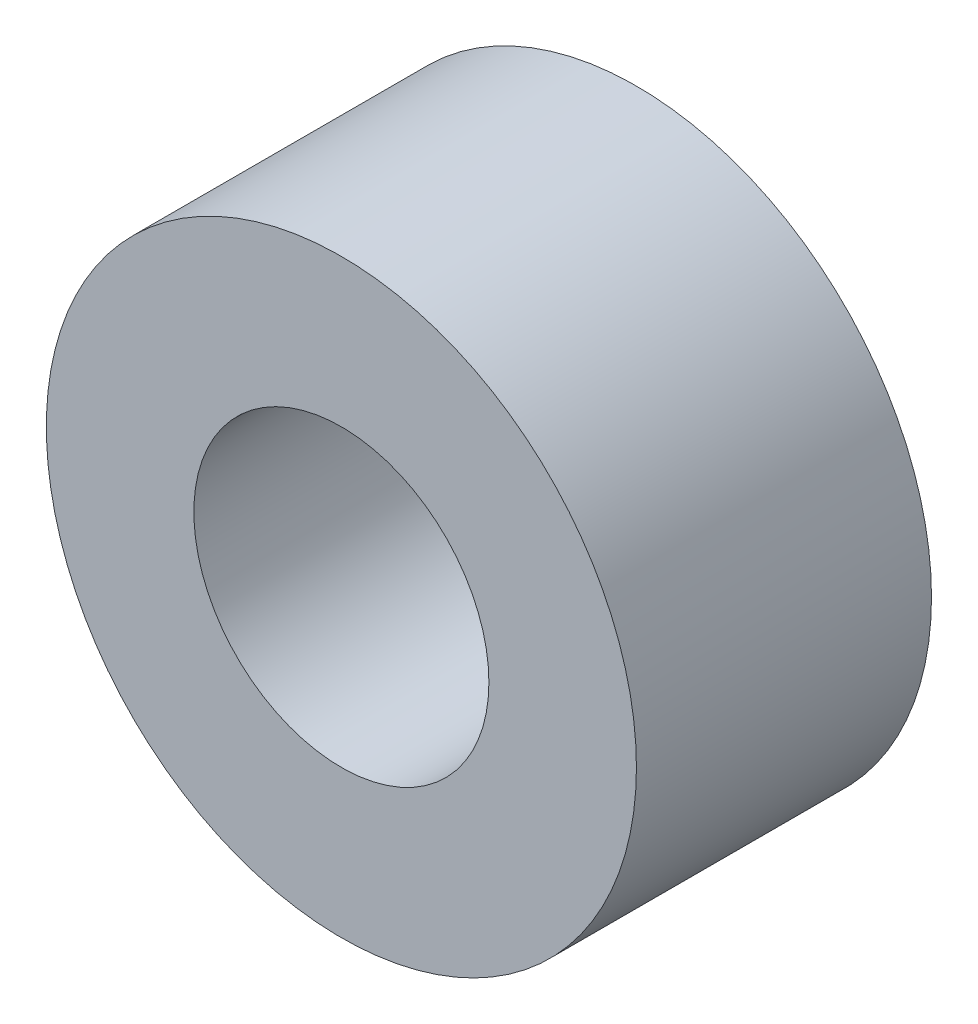
ISO-10303-21;
HEADER;
FILE_DESCRIPTION(('STEP AP214'),'2;1');
FILE_NAME('part.step','',(''),(''),'','','');
FILE_SCHEMA(('AUTOMOTIVE_DESIGN { 1 0 10303 214 1 1 1 1 }'));
ENDSEC;
DATA;
#1=APPLICATION_CONTEXT('core data for automotive mechanical design processes');
#2=APPLICATION_PROTOCOL_DEFINITION('international standard','automotive_design',2000,#1);
#3=PRODUCT_CONTEXT('',#1,'mechanical');
#4=PRODUCT('Part','Part','',(#3));
#5=PRODUCT_RELATED_PRODUCT_CATEGORY('part','',(#4));
#6=PRODUCT_DEFINITION_FORMATION('','',#4);
#7=PRODUCT_DEFINITION_CONTEXT('part definition',#1,'design');
#8=PRODUCT_DEFINITION('design','',#6,#7);
#9=PRODUCT_DEFINITION_SHAPE('','',#8);
#10=(LENGTH_UNIT() NAMED_UNIT(*) SI_UNIT(.MILLI.,.METRE.));
#11=(NAMED_UNIT(*) PLANE_ANGLE_UNIT() SI_UNIT($,.RADIAN.));
#12=(NAMED_UNIT(*) SI_UNIT($,.STERADIAN.) SOLID_ANGLE_UNIT());
#13=UNCERTAINTY_MEASURE_WITH_UNIT(LENGTH_MEASURE(1.E-05),#10,'distance_accuracy_value','');
#14=(GEOMETRIC_REPRESENTATION_CONTEXT(3) GLOBAL_UNCERTAINTY_ASSIGNED_CONTEXT((#13)) GLOBAL_UNIT_ASSIGNED_CONTEXT((#10,
#11,#12)) REPRESENTATION_CONTEXT('',''));
#15=CARTESIAN_POINT('',(0.,0.,0.));
#16=DIRECTION('',(0.,0.,1.));
#17=DIRECTION('',(1.,0.,0.));
#18=AXIS2_PLACEMENT_3D('',#15,#16,#17);
#19=CARTESIAN_POINT('',(0.,0.,8.));
#20=DIRECTION('',(0.,0.,1.));
#21=DIRECTION('',(1.,0.,0.));
#22=AXIS2_PLACEMENT_3D('',#19,#20,#21);
#23=PLANE('',#22);
#24=CARTESIAN_POINT('',(0.,0.,8.));
#25=DIRECTION('',(0.,0.,1.));
#26=DIRECTION('',(1.,0.,0.));
#27=AXIS2_PLACEMENT_3D('',#24,#25,#26);
#28=CIRCLE('',#27,8.);
#29=CARTESIAN_POINT('',(8.,0.,8.));
#30=VERTEX_POINT('',#29);
#31=EDGE_CURVE('E10',#30,#30,#28,.T.);
#32=ORIENTED_EDGE('',*,*,#31,.T.);
#33=EDGE_LOOP('',(#32));
#34=FACE_BOUND('',#33,.T.);
#35=CARTESIAN_POINT('',(0.,0.,8.));
#36=DIRECTION('',(0.,0.,1.));
#37=DIRECTION('',(1.,0.,0.));
#38=AXIS2_PLACEMENT_3D('',#35,#36,#37);
#39=CIRCLE('',#38,4.);
#40=CARTESIAN_POINT('',(4.,0.,8.));
#41=VERTEX_POINT('',#40);
#42=EDGE_CURVE('E48',#41,#41,#39,.T.);
#43=ORIENTED_EDGE('',*,*,#42,.F.);
#44=EDGE_LOOP('',(#43));
#45=FACE_BOUND('',#44,.T.);
#46=ADVANCED_FACE('F40',(#34,#45),#23,.T.);
#47=CARTESIAN_POINT('',(0.,0.,0.));
#48=DIRECTION('',(0.,0.,1.));
#49=DIRECTION('',(1.,0.,0.));
#50=AXIS2_PLACEMENT_3D('',#47,#48,#49);
#51=PLANE('',#50);
#52=CARTESIAN_POINT('',(0.,0.,0.));
#53=DIRECTION('',(0.,0.,1.));
#54=DIRECTION('',(1.,0.,0.));
#55=AXIS2_PLACEMENT_3D('',#52,#53,#54);
#56=CIRCLE('',#55,8.);
#57=CARTESIAN_POINT('',(8.,0.,0.));
#58=VERTEX_POINT('',#57);
#59=EDGE_CURVE('E41',#58,#58,#56,.T.);
#60=ORIENTED_EDGE('',*,*,#59,.F.);
#61=EDGE_LOOP('',(#60));
#62=FACE_BOUND('',#61,.T.);
#63=CARTESIAN_POINT('',(0.,0.,0.));
#64=DIRECTION('',(0.,0.,1.));
#65=DIRECTION('',(1.,0.,0.));
#66=AXIS2_PLACEMENT_3D('',#63,#64,#65);
#67=CIRCLE('',#66,4.);
#68=CARTESIAN_POINT('',(4.,0.,0.));
#69=VERTEX_POINT('',#68);
#70=EDGE_CURVE('E49',#69,#69,#67,.T.);
#71=ORIENTED_EDGE('',*,*,#70,.T.);
#72=EDGE_LOOP('',(#71));
#73=FACE_BOUND('',#72,.T.);
#74=ADVANCED_FACE('F58',(#62,#73),#51,.F.);
#75=CARTESIAN_POINT('',(0.,0.,8.));
#76=DIRECTION('',(0.,0.,-1.));
#77=DIRECTION('',(-1.,0.,0.));
#78=AXIS2_PLACEMENT_3D('',#75,#76,#77);
#79=CYLINDRICAL_SURFACE('',#78,8.);
#80=ORIENTED_EDGE('',*,*,#31,.F.);
#81=EDGE_LOOP('',(#80));
#82=FACE_BOUND('',#81,.T.);
#83=ORIENTED_EDGE('',*,*,#59,.T.);
#84=EDGE_LOOP('',(#83));
#85=FACE_BOUND('',#84,.T.);
#86=ADVANCED_FACE('F39',(#82,#85),#79,.T.);
#87=CARTESIAN_POINT('',(0.,0.,8.));
#88=DIRECTION('',(0.,0.,-1.));
#89=DIRECTION('',(-1.,0.,0.));
#90=AXIS2_PLACEMENT_3D('',#87,#88,#89);
#91=CYLINDRICAL_SURFACE('',#90,4.);
#92=ORIENTED_EDGE('',*,*,#42,.T.);
#93=EDGE_LOOP('',(#92));
#94=FACE_BOUND('',#93,.T.);
#95=ORIENTED_EDGE('',*,*,#70,.F.);
#96=EDGE_LOOP('',(#95));
#97=FACE_BOUND('',#96,.T.);
#98=ADVANCED_FACE('F57',(#94,#97),#91,.F.);
#99=CLOSED_SHELL('',(#46,#74,#86,#98));
#100=MANIFOLD_SOLID_BREP('B2',#99);
#101=ADVANCED_BREP_SHAPE_REPRESENTATION('',(#18,#100),#14);
#102=SHAPE_DEFINITION_REPRESENTATION(#9,#101);
ENDSEC;
END-ISO-10303-21;
